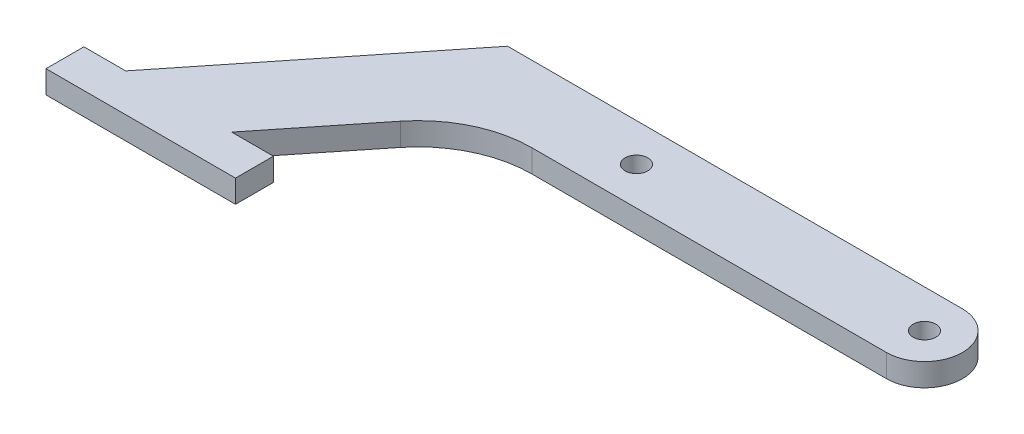
ISO-10303-21;
HEADER;
FILE_DESCRIPTION(('STEP AP214'),'2;1');
FILE_NAME('part.step','',(''),(''),'','','');
FILE_SCHEMA(('AUTOMOTIVE_DESIGN { 1 0 10303 214 1 1 1 1 }'));
ENDSEC;
DATA;
#1=APPLICATION_CONTEXT('core data for automotive mechanical design processes');
#2=APPLICATION_PROTOCOL_DEFINITION('international standard','automotive_design',2000,#1);
#3=PRODUCT_CONTEXT('',#1,'mechanical');
#4=PRODUCT('Part','Part','',(#3));
#5=PRODUCT_RELATED_PRODUCT_CATEGORY('part','',(#4));
#6=PRODUCT_DEFINITION_FORMATION('','',#4);
#7=PRODUCT_DEFINITION_CONTEXT('part definition',#1,'design');
#8=PRODUCT_DEFINITION('design','',#6,#7);
#9=PRODUCT_DEFINITION_SHAPE('','',#8);
#10=(LENGTH_UNIT() NAMED_UNIT(*) SI_UNIT(.MILLI.,.METRE.));
#11=(NAMED_UNIT(*) PLANE_ANGLE_UNIT() SI_UNIT($,.RADIAN.));
#12=(NAMED_UNIT(*) SI_UNIT($,.STERADIAN.) SOLID_ANGLE_UNIT());
#13=UNCERTAINTY_MEASURE_WITH_UNIT(LENGTH_MEASURE(1.E-05),#10,'distance_accuracy_value','');
#14=(GEOMETRIC_REPRESENTATION_CONTEXT(3) GLOBAL_UNCERTAINTY_ASSIGNED_CONTEXT((#13)) GLOBAL_UNIT_ASSIGNED_CONTEXT((#10,
#11,#12)) REPRESENTATION_CONTEXT('',''));
#15=CARTESIAN_POINT('',(0.,0.,0.));
#16=DIRECTION('',(0.,0.,1.));
#17=DIRECTION('',(1.,0.,0.));
#18=AXIS2_PLACEMENT_3D('',#15,#16,#17);
#19=CARTESIAN_POINT('',(0.,3.,0.));
#20=DIRECTION('',(0.,1.,0.));
#21=DIRECTION('',(0.,0.,1.));
#22=AXIS2_PLACEMENT_3D('',#19,#20,#21);
#23=PLANE('',#22);
#24=CARTESIAN_POINT('',(0.,3.,0.));
#25=DIRECTION('',(0.,1.,0.));
#26=DIRECTION('',(0.,0.,1.));
#27=AXIS2_PLACEMENT_3D('',#24,#25,#26);
#28=CIRCLE('',#27,1.5);
#29=CARTESIAN_POINT('',(0.,3.,1.5));
#30=VERTEX_POINT('',#29);
#31=EDGE_CURVE('E188',#30,#30,#28,.T.);
#32=ORIENTED_EDGE('',*,*,#31,.F.);
#33=EDGE_LOOP('',(#32));
#34=FACE_BOUND('',#33,.T.);
#35=CARTESIAN_POINT('',(0.,3.,0.));
#36=DIRECTION('',(0.,1.,0.));
#37=DIRECTION('',(0.,0.,1.));
#38=AXIS2_PLACEMENT_3D('',#35,#36,#37);
#39=CIRCLE('',#38,5.);
#40=CARTESIAN_POINT('',(0.,3.,5.));
#41=VERTEX_POINT('',#40);
#42=CARTESIAN_POINT('',(0.,3.,-5.));
#43=VERTEX_POINT('',#42);
#44=EDGE_CURVE('E129',#41,#43,#39,.T.);
#45=ORIENTED_EDGE('',*,*,#44,.T.);
#46=DIRECTION('',(-1.,0.,0.));
#47=VECTOR('',#46,1.);
#48=CARTESIAN_POINT('',(0.,3.,-5.));
#49=LINE('',#48,#47);
#50=CARTESIAN_POINT('',(-60.,3.,-4.99999999999999));
#51=VERTEX_POINT('',#50);
#52=EDGE_CURVE('E118',#43,#51,#49,.T.);
#53=ORIENTED_EDGE('',*,*,#52,.T.);
#54=DIRECTION('',(-0.62400043966883,0.,0.781423989453297));
#55=VECTOR('',#54,1.);
#56=CARTESIAN_POINT('',(-60.,3.,-4.99999999999999));
#57=LINE('',#56,#55);
#58=CARTESIAN_POINT('',(-82.3717425215033,3.,23.0157114976602));
#59=VERTEX_POINT('',#58);
#60=EDGE_CURVE('E128',#51,#59,#57,.T.);
#61=ORIENTED_EDGE('',*,*,#60,.T.);
#62=DIRECTION('',(-1.,0.,0.));
#63=VECTOR('',#62,1.);
#64=CARTESIAN_POINT('',(-87.8790289108974,3.,23.0157114976602));
#65=LINE('',#64,#63);
#66=CARTESIAN_POINT('',(-87.8790289108974,3.,23.0157114976602));
#67=VERTEX_POINT('',#66);
#68=EDGE_CURVE('E200',#59,#67,#65,.T.);
#69=ORIENTED_EDGE('',*,*,#68,.T.);
#70=DIRECTION('',(0.,0.,1.));
#71=VECTOR('',#70,1.);
#72=CARTESIAN_POINT('',(-87.8790289108974,3.,28.0157114976602));
#73=LINE('',#72,#71);
#74=CARTESIAN_POINT('',(-87.8790289108974,3.,28.0157114976602));
#75=VERTEX_POINT('',#74);
#76=EDGE_CURVE('E198',#67,#75,#73,.T.);
#77=ORIENTED_EDGE('',*,*,#76,.T.);
#78=DIRECTION('',(1.,0.,0.));
#79=VECTOR('',#78,1.);
#80=CARTESIAN_POINT('',(-62.8790289108974,3.,28.0157114976602));
#81=LINE('',#80,#79);
#82=CARTESIAN_POINT('',(-62.8790289108974,3.,28.0157114976602));
#83=VERTEX_POINT('',#82);
#84=EDGE_CURVE('E196',#75,#83,#81,.T.);
#85=ORIENTED_EDGE('',*,*,#84,.T.);
#86=DIRECTION('',(0.,0.,-1.));
#87=VECTOR('',#86,1.);
#88=CARTESIAN_POINT('',(-62.8790289108974,3.,23.0157114976602));
#89=LINE('',#88,#87);
#90=CARTESIAN_POINT('',(-62.8790289108974,3.,23.0157114976602));
#91=VERTEX_POINT('',#90);
#92=EDGE_CURVE('E194',#83,#91,#89,.T.);
#93=ORIENTED_EDGE('',*,*,#92,.T.);
#94=DIRECTION('',(-1.,0.,0.));
#95=VECTOR('',#94,1.);
#96=CARTESIAN_POINT('',(-68.3863153002915,3.,23.0157114976602));
#97=LINE('',#96,#95);
#98=CARTESIAN_POINT('',(-68.3863153002915,3.,23.0157114976602));
#99=VERTEX_POINT('',#98);
#100=EDGE_CURVE('E192',#91,#99,#97,.T.);
#101=ORIENTED_EDGE('',*,*,#100,.T.);
#102=DIRECTION('',(0.62400043966883,0.,-0.781423989453297));
#103=VECTOR('',#102,1.);
#104=CARTESIAN_POINT('',(-54.,3.,5.00000000000001));
#105=LINE('',#104,#103);
#106=CARTESIAN_POINT('',(-58.5037756863483,3.,10.6399934049675));
#107=VERTEX_POINT('',#106);
#108=EDGE_CURVE('E190',#99,#107,#105,.T.);
#109=ORIENTED_EDGE('',*,*,#108,.T.);
#110=CARTESIAN_POINT('',(-46.7824158445489,3.,20.));
#111=DIRECTION('',(0.,1.,0.));
#112=DIRECTION('',(0.,0.,1.));
#113=AXIS2_PLACEMENT_3D('',#110,#111,#112);
#114=CIRCLE('',#113,15.);
#115=CARTESIAN_POINT('',(-46.7824158445489,3.,5.00000000000001));
#116=VERTEX_POINT('',#115);
#117=EDGE_CURVE('E11',#107,#116,#114,.F.);
#118=ORIENTED_EDGE('',*,*,#117,.T.);
#119=DIRECTION('',(1.,0.,0.));
#120=VECTOR('',#119,1.);
#121=CARTESIAN_POINT('',(0.,3.,5.));
#122=LINE('',#121,#120);
#123=EDGE_CURVE('E134',#116,#41,#122,.T.);
#124=ORIENTED_EDGE('',*,*,#123,.T.);
#125=EDGE_LOOP('',(#45,#53,#61,#69,#77,#85,#93,#101,#109,#118,#124));
#126=FACE_BOUND('',#125,.T.);
#127=CARTESIAN_POINT('',(-38.,3.,0.));
#128=DIRECTION('',(0.,1.,0.));
#129=DIRECTION('',(0.,0.,1.));
#130=AXIS2_PLACEMENT_3D('',#127,#128,#129);
#131=CIRCLE('',#130,1.5);
#132=CARTESIAN_POINT('',(-38.,3.,1.5));
#133=VERTEX_POINT('',#132);
#134=EDGE_CURVE('E206',#133,#133,#131,.T.);
#135=ORIENTED_EDGE('',*,*,#134,.F.);
#136=EDGE_LOOP('',(#135));
#137=FACE_BOUND('',#136,.T.);
#138=ADVANCED_FACE('F35',(#34,#126,#137),#23,.T.);
#139=CARTESIAN_POINT('',(0.,0.,0.));
#140=DIRECTION('',(0.,1.,0.));
#141=DIRECTION('',(0.,0.,1.));
#142=AXIS2_PLACEMENT_3D('',#139,#140,#141);
#143=PLANE('',#142);
#144=CARTESIAN_POINT('',(0.,0.,0.));
#145=DIRECTION('',(0.,1.,0.));
#146=DIRECTION('',(0.,0.,1.));
#147=AXIS2_PLACEMENT_3D('',#144,#145,#146);
#148=CIRCLE('',#147,5.);
#149=CARTESIAN_POINT('',(0.,0.,5.));
#150=VERTEX_POINT('',#149);
#151=CARTESIAN_POINT('',(0.,0.,-5.));
#152=VERTEX_POINT('',#151);
#153=EDGE_CURVE('E142',#150,#152,#148,.T.);
#154=ORIENTED_EDGE('',*,*,#153,.F.);
#155=DIRECTION('',(1.,0.,0.));
#156=VECTOR('',#155,1.);
#157=CARTESIAN_POINT('',(0.,0.,5.));
#158=LINE('',#157,#156);
#159=CARTESIAN_POINT('',(-46.7824158445489,0.,5.00000000000001));
#160=VERTEX_POINT('',#159);
#161=EDGE_CURVE('E138',#160,#150,#158,.T.);
#162=ORIENTED_EDGE('',*,*,#161,.F.);
#163=CARTESIAN_POINT('',(-46.7824158445489,0.,20.));
#164=DIRECTION('',(0.,1.,0.));
#165=DIRECTION('',(0.,0.,1.));
#166=AXIS2_PLACEMENT_3D('',#163,#164,#165);
#167=CIRCLE('',#166,15.);
#168=CARTESIAN_POINT('',(-58.5037756863483,0.,10.6399934049675));
#169=VERTEX_POINT('',#168);
#170=EDGE_CURVE('E43',#160,#169,#167,.T.);
#171=ORIENTED_EDGE('',*,*,#170,.T.);
#172=DIRECTION('',(0.62400043966883,0.,-0.781423989453297));
#173=VECTOR('',#172,1.);
#174=CARTESIAN_POINT('',(-54.,0.,5.00000000000001));
#175=LINE('',#174,#173);
#176=CARTESIAN_POINT('',(-68.3863153002915,0.,23.0157114976602));
#177=VERTEX_POINT('',#176);
#178=EDGE_CURVE('E171',#177,#169,#175,.T.);
#179=ORIENTED_EDGE('',*,*,#178,.F.);
#180=DIRECTION('',(-1.,0.,0.));
#181=VECTOR('',#180,1.);
#182=CARTESIAN_POINT('',(-68.3863153002915,0.,23.0157114976602));
#183=LINE('',#182,#181);
#184=CARTESIAN_POINT('',(-62.8790289108974,0.,23.0157114976602));
#185=VERTEX_POINT('',#184);
#186=EDGE_CURVE('E173',#185,#177,#183,.T.);
#187=ORIENTED_EDGE('',*,*,#186,.F.);
#188=DIRECTION('',(0.,0.,-1.));
#189=VECTOR('',#188,1.);
#190=CARTESIAN_POINT('',(-62.8790289108974,0.,23.0157114976602));
#191=LINE('',#190,#189);
#192=CARTESIAN_POINT('',(-62.8790289108974,0.,28.0157114976602));
#193=VERTEX_POINT('',#192);
#194=EDGE_CURVE('E175',#193,#185,#191,.T.);
#195=ORIENTED_EDGE('',*,*,#194,.F.);
#196=DIRECTION('',(1.,0.,0.));
#197=VECTOR('',#196,1.);
#198=CARTESIAN_POINT('',(-62.8790289108974,0.,28.0157114976602));
#199=LINE('',#198,#197);
#200=CARTESIAN_POINT('',(-87.8790289108974,0.,28.0157114976602));
#201=VERTEX_POINT('',#200);
#202=EDGE_CURVE('E177',#201,#193,#199,.T.);
#203=ORIENTED_EDGE('',*,*,#202,.F.);
#204=DIRECTION('',(0.,0.,1.));
#205=VECTOR('',#204,1.);
#206=CARTESIAN_POINT('',(-87.8790289108974,0.,28.0157114976602));
#207=LINE('',#206,#205);
#208=CARTESIAN_POINT('',(-87.8790289108974,0.,23.0157114976602));
#209=VERTEX_POINT('',#208);
#210=EDGE_CURVE('E179',#209,#201,#207,.T.);
#211=ORIENTED_EDGE('',*,*,#210,.F.);
#212=DIRECTION('',(-1.,0.,0.));
#213=VECTOR('',#212,1.);
#214=CARTESIAN_POINT('',(-87.8790289108974,0.,23.0157114976602));
#215=LINE('',#214,#213);
#216=CARTESIAN_POINT('',(-82.3717425215033,0.,23.0157114976602));
#217=VERTEX_POINT('',#216);
#218=EDGE_CURVE('E181',#217,#209,#215,.T.);
#219=ORIENTED_EDGE('',*,*,#218,.F.);
#220=DIRECTION('',(-0.62400043966883,0.,0.781423989453297));
#221=VECTOR('',#220,1.);
#222=CARTESIAN_POINT('',(-60.,0.,-4.99999999999999));
#223=LINE('',#222,#221);
#224=CARTESIAN_POINT('',(-60.,0.,-4.99999999999999));
#225=VERTEX_POINT('',#224);
#226=EDGE_CURVE('E183',#225,#217,#223,.T.);
#227=ORIENTED_EDGE('',*,*,#226,.F.);
#228=DIRECTION('',(-1.,0.,0.));
#229=VECTOR('',#228,1.);
#230=CARTESIAN_POINT('',(0.,0.,-5.));
#231=LINE('',#230,#229);
#232=EDGE_CURVE('E185',#152,#225,#231,.T.);
#233=ORIENTED_EDGE('',*,*,#232,.F.);
#234=EDGE_LOOP('',(#154,#162,#171,#179,#187,#195,#203,#211,#219,#227,#233));
#235=FACE_BOUND('',#234,.T.);
#236=CARTESIAN_POINT('',(0.,0.,0.));
#237=DIRECTION('',(0.,1.,0.));
#238=DIRECTION('',(0.,0.,1.));
#239=AXIS2_PLACEMENT_3D('',#236,#237,#238);
#240=CIRCLE('',#239,1.5);
#241=CARTESIAN_POINT('',(0.,0.,1.5));
#242=VERTEX_POINT('',#241);
#243=EDGE_CURVE('E203',#242,#242,#240,.T.);
#244=ORIENTED_EDGE('',*,*,#243,.T.);
#245=EDGE_LOOP('',(#244));
#246=FACE_BOUND('',#245,.T.);
#247=CARTESIAN_POINT('',(-38.,0.,0.));
#248=DIRECTION('',(0.,1.,0.));
#249=DIRECTION('',(0.,0.,1.));
#250=AXIS2_PLACEMENT_3D('',#247,#248,#249);
#251=CIRCLE('',#250,1.5);
#252=CARTESIAN_POINT('',(-38.,0.,1.5));
#253=VERTEX_POINT('',#252);
#254=EDGE_CURVE('E209',#253,#253,#251,.T.);
#255=ORIENTED_EDGE('',*,*,#254,.T.);
#256=EDGE_LOOP('',(#255));
#257=FACE_BOUND('',#256,.T.);
#258=ADVANCED_FACE('F218',(#235,#246,#257),#143,.F.);
#259=CARTESIAN_POINT('',(0.,3.,0.));
#260=DIRECTION('',(0.,-1.,0.));
#261=DIRECTION('',(0.,0.,-1.));
#262=AXIS2_PLACEMENT_3D('',#259,#260,#261);
#263=CYLINDRICAL_SURFACE('',#262,5.);
#264=ORIENTED_EDGE('',*,*,#153,.T.);
#265=DIRECTION('',(0.,-1.,0.));
#266=VECTOR('',#265,1.);
#267=CARTESIAN_POINT('',(0.,3.,-5.));
#268=LINE('',#267,#266);
#269=EDGE_CURVE('E122',#43,#152,#268,.T.);
#270=ORIENTED_EDGE('',*,*,#269,.F.);
#271=ORIENTED_EDGE('',*,*,#44,.F.);
#272=DIRECTION('',(0.,-1.,0.));
#273=VECTOR('',#272,1.);
#274=CARTESIAN_POINT('',(0.,3.,5.));
#275=LINE('',#274,#273);
#276=EDGE_CURVE('E168',#41,#150,#275,.T.);
#277=ORIENTED_EDGE('',*,*,#276,.T.);
#278=EDGE_LOOP('',(#264,#270,#271,#277));
#279=FACE_BOUND('',#278,.T.);
#280=ADVANCED_FACE('F140',(#279),#263,.T.);
#281=CARTESIAN_POINT('',(0.,3.,-5.));
#282=DIRECTION('',(0.,0.,1.));
#283=DIRECTION('',(1.,0.,0.));
#284=AXIS2_PLACEMENT_3D('',#281,#282,#283);
#285=PLANE('',#284);
#286=ORIENTED_EDGE('',*,*,#232,.T.);
#287=DIRECTION('',(0.,-1.,0.));
#288=VECTOR('',#287,1.);
#289=CARTESIAN_POINT('',(-60.,3.,-4.99999999999999));
#290=LINE('',#289,#288);
#291=EDGE_CURVE('E125',#51,#225,#290,.T.);
#292=ORIENTED_EDGE('',*,*,#291,.F.);
#293=ORIENTED_EDGE('',*,*,#52,.F.);
#294=ORIENTED_EDGE('',*,*,#269,.T.);
#295=EDGE_LOOP('',(#286,#292,#293,#294));
#296=FACE_BOUND('',#295,.T.);
#297=ADVANCED_FACE('F120',(#296),#285,.F.);
#298=CARTESIAN_POINT('',(-60.,3.,-4.99999999999999));
#299=DIRECTION('',(0.781423989453297,0.,0.62400043966883));
#300=DIRECTION('',(0.62400043966883,0.,-0.781423989453297));
#301=AXIS2_PLACEMENT_3D('',#298,#299,#300);
#302=PLANE('',#301);
#303=ORIENTED_EDGE('',*,*,#226,.T.);
#304=DIRECTION('',(0.,-1.,0.));
#305=VECTOR('',#304,1.);
#306=CARTESIAN_POINT('',(-82.3717425215033,3.,23.0157114976602));
#307=LINE('',#306,#305);
#308=EDGE_CURVE('E147',#59,#217,#307,.T.);
#309=ORIENTED_EDGE('',*,*,#308,.F.);
#310=ORIENTED_EDGE('',*,*,#60,.F.);
#311=ORIENTED_EDGE('',*,*,#291,.T.);
#312=EDGE_LOOP('',(#303,#309,#310,#311));
#313=FACE_BOUND('',#312,.T.);
#314=ADVANCED_FACE('F256',(#313),#302,.F.);
#315=CARTESIAN_POINT('',(-87.8790289108974,3.,23.0157114976602));
#316=DIRECTION('',(0.,0.,1.));
#317=DIRECTION('',(1.,0.,0.));
#318=AXIS2_PLACEMENT_3D('',#315,#316,#317);
#319=PLANE('',#318);
#320=ORIENTED_EDGE('',*,*,#218,.T.);
#321=DIRECTION('',(0.,-1.,0.));
#322=VECTOR('',#321,1.);
#323=CARTESIAN_POINT('',(-87.8790289108974,3.,23.0157114976602));
#324=LINE('',#323,#322);
#325=EDGE_CURVE('E153',#67,#209,#324,.T.);
#326=ORIENTED_EDGE('',*,*,#325,.F.);
#327=ORIENTED_EDGE('',*,*,#68,.F.);
#328=ORIENTED_EDGE('',*,*,#308,.T.);
#329=EDGE_LOOP('',(#320,#326,#327,#328));
#330=FACE_BOUND('',#329,.T.);
#331=ADVANCED_FACE('F252',(#330),#319,.F.);
#332=CARTESIAN_POINT('',(-87.8790289108974,3.,28.0157114976602));
#333=DIRECTION('',(1.,0.,0.));
#334=DIRECTION('',(0.,0.,-1.));
#335=AXIS2_PLACEMENT_3D('',#332,#333,#334);
#336=PLANE('',#335);
#337=ORIENTED_EDGE('',*,*,#210,.T.);
#338=DIRECTION('',(0.,-1.,0.));
#339=VECTOR('',#338,1.);
#340=CARTESIAN_POINT('',(-87.8790289108974,3.,28.0157114976602));
#341=LINE('',#340,#339);
#342=EDGE_CURVE('E156',#75,#201,#341,.T.);
#343=ORIENTED_EDGE('',*,*,#342,.F.);
#344=ORIENTED_EDGE('',*,*,#76,.F.);
#345=ORIENTED_EDGE('',*,*,#325,.T.);
#346=EDGE_LOOP('',(#337,#343,#344,#345));
#347=FACE_BOUND('',#346,.T.);
#348=ADVANCED_FACE('F248',(#347),#336,.F.);
#349=CARTESIAN_POINT('',(-62.8790289108974,3.,28.0157114976602));
#350=DIRECTION('',(0.,0.,-1.));
#351=DIRECTION('',(-1.,0.,0.));
#352=AXIS2_PLACEMENT_3D('',#349,#350,#351);
#353=PLANE('',#352);
#354=ORIENTED_EDGE('',*,*,#202,.T.);
#355=DIRECTION('',(0.,-1.,0.));
#356=VECTOR('',#355,1.);
#357=CARTESIAN_POINT('',(-62.8790289108974,3.,28.0157114976602));
#358=LINE('',#357,#356);
#359=EDGE_CURVE('E159',#83,#193,#358,.T.);
#360=ORIENTED_EDGE('',*,*,#359,.F.);
#361=ORIENTED_EDGE('',*,*,#84,.F.);
#362=ORIENTED_EDGE('',*,*,#342,.T.);
#363=EDGE_LOOP('',(#354,#360,#361,#362));
#364=FACE_BOUND('',#363,.T.);
#365=ADVANCED_FACE('F244',(#364),#353,.F.);
#366=CARTESIAN_POINT('',(-62.8790289108974,3.,23.0157114976602));
#367=DIRECTION('',(-1.,0.,0.));
#368=DIRECTION('',(0.,0.,1.));
#369=AXIS2_PLACEMENT_3D('',#366,#367,#368);
#370=PLANE('',#369);
#371=ORIENTED_EDGE('',*,*,#194,.T.);
#372=DIRECTION('',(0.,-1.,0.));
#373=VECTOR('',#372,1.);
#374=CARTESIAN_POINT('',(-62.8790289108974,3.,23.0157114976602));
#375=LINE('',#374,#373);
#376=EDGE_CURVE('E162',#91,#185,#375,.T.);
#377=ORIENTED_EDGE('',*,*,#376,.F.);
#378=ORIENTED_EDGE('',*,*,#92,.F.);
#379=ORIENTED_EDGE('',*,*,#359,.T.);
#380=EDGE_LOOP('',(#371,#377,#378,#379));
#381=FACE_BOUND('',#380,.T.);
#382=ADVANCED_FACE('F240',(#381),#370,.F.);
#383=CARTESIAN_POINT('',(-68.3863153002915,3.,23.0157114976602));
#384=DIRECTION('',(0.,0.,1.));
#385=DIRECTION('',(1.,0.,0.));
#386=AXIS2_PLACEMENT_3D('',#383,#384,#385);
#387=PLANE('',#386);
#388=ORIENTED_EDGE('',*,*,#186,.T.);
#389=DIRECTION('',(0.,-1.,0.));
#390=VECTOR('',#389,1.);
#391=CARTESIAN_POINT('',(-68.3863153002915,3.,23.0157114976602));
#392=LINE('',#391,#390);
#393=EDGE_CURVE('E165',#99,#177,#392,.T.);
#394=ORIENTED_EDGE('',*,*,#393,.F.);
#395=ORIENTED_EDGE('',*,*,#100,.F.);
#396=ORIENTED_EDGE('',*,*,#376,.T.);
#397=EDGE_LOOP('',(#388,#394,#395,#396));
#398=FACE_BOUND('',#397,.T.);
#399=ADVANCED_FACE('F237',(#398),#387,.F.);
#400=CARTESIAN_POINT('',(-54.,3.,5.00000000000001));
#401=DIRECTION('',(-0.781423989453297,0.,-0.62400043966883));
#402=DIRECTION('',(-0.62400043966883,0.,0.781423989453297));
#403=AXIS2_PLACEMENT_3D('',#400,#401,#402);
#404=PLANE('',#403);
#405=ORIENTED_EDGE('',*,*,#178,.T.);
#406=DIRECTION('',(0.,-1.,0.));
#407=VECTOR('',#406,1.);
#408=CARTESIAN_POINT('',(-58.5037756863483,3.,10.6399934049676));
#409=LINE('',#408,#407);
#410=EDGE_CURVE('E50',#169,#107,#409,.F.);
#411=ORIENTED_EDGE('',*,*,#410,.T.);
#412=ORIENTED_EDGE('',*,*,#108,.F.);
#413=ORIENTED_EDGE('',*,*,#393,.T.);
#414=EDGE_LOOP('',(#405,#411,#412,#413));
#415=FACE_BOUND('',#414,.T.);
#416=ADVANCED_FACE('F233',(#415),#404,.F.);
#417=CARTESIAN_POINT('',(0.,3.,5.));
#418=DIRECTION('',(0.,0.,-1.));
#419=DIRECTION('',(-1.,0.,0.));
#420=AXIS2_PLACEMENT_3D('',#417,#418,#419);
#421=PLANE('',#420);
#422=ORIENTED_EDGE('',*,*,#123,.F.);
#423=DIRECTION('',(0.,-1.,0.));
#424=VECTOR('',#423,1.);
#425=CARTESIAN_POINT('',(-46.7824158445489,0.,5.00000000000001));
#426=LINE('',#425,#424);
#427=EDGE_CURVE('E143',#116,#160,#426,.T.);
#428=ORIENTED_EDGE('',*,*,#427,.T.);
#429=ORIENTED_EDGE('',*,*,#161,.T.);
#430=ORIENTED_EDGE('',*,*,#276,.F.);
#431=EDGE_LOOP('',(#422,#428,#429,#430));
#432=FACE_BOUND('',#431,.T.);
#433=ADVANCED_FACE('F230',(#432),#421,.F.);
#434=CARTESIAN_POINT('',(0.,3.,0.));
#435=DIRECTION('',(0.,-1.,0.));
#436=DIRECTION('',(0.,0.,-1.));
#437=AXIS2_PLACEMENT_3D('',#434,#435,#436);
#438=CYLINDRICAL_SURFACE('',#437,1.5);
#439=ORIENTED_EDGE('',*,*,#31,.T.);
#440=EDGE_LOOP('',(#439));
#441=FACE_BOUND('',#440,.T.);
#442=ORIENTED_EDGE('',*,*,#243,.F.);
#443=EDGE_LOOP('',(#442));
#444=FACE_BOUND('',#443,.T.);
#445=ADVANCED_FACE('F227',(#441,#444),#438,.F.);
#446=CARTESIAN_POINT('',(-38.,3.,0.));
#447=DIRECTION('',(0.,-1.,0.));
#448=DIRECTION('',(0.,0.,-1.));
#449=AXIS2_PLACEMENT_3D('',#446,#447,#448);
#450=CYLINDRICAL_SURFACE('',#449,1.5);
#451=ORIENTED_EDGE('',*,*,#134,.T.);
#452=EDGE_LOOP('',(#451));
#453=FACE_BOUND('',#452,.T.);
#454=ORIENTED_EDGE('',*,*,#254,.F.);
#455=EDGE_LOOP('',(#454));
#456=FACE_BOUND('',#455,.T.);
#457=ADVANCED_FACE('F215',(#453,#456),#450,.F.);
#458=CARTESIAN_POINT('',(-46.7824158445489,3.,20.));
#459=DIRECTION('',(0.,1.,0.));
#460=DIRECTION('',(0.,0.,1.));
#461=AXIS2_PLACEMENT_3D('',#458,#459,#460);
#462=CYLINDRICAL_SURFACE('',#461,15.);
#463=ORIENTED_EDGE('',*,*,#117,.F.);
#464=ORIENTED_EDGE('',*,*,#410,.F.);
#465=ORIENTED_EDGE('',*,*,#170,.F.);
#466=ORIENTED_EDGE('',*,*,#427,.F.);
#467=EDGE_LOOP('',(#463,#464,#465,#466));
#468=FACE_BOUND('',#467,.T.);
#469=ADVANCED_FACE('F37',(#468),#462,.F.);
#470=CLOSED_SHELL('',(#138,#258,#280,#297,#314,#331,#348,#365,#382,#399,#416,#433,#445,#457,#469));
#471=MANIFOLD_SOLID_BREP('B2',#470);
#472=ADVANCED_BREP_SHAPE_REPRESENTATION('',(#18,#471),#14);
#473=SHAPE_DEFINITION_REPRESENTATION(#9,#472);
ENDSEC;
END-ISO-10303-21;
